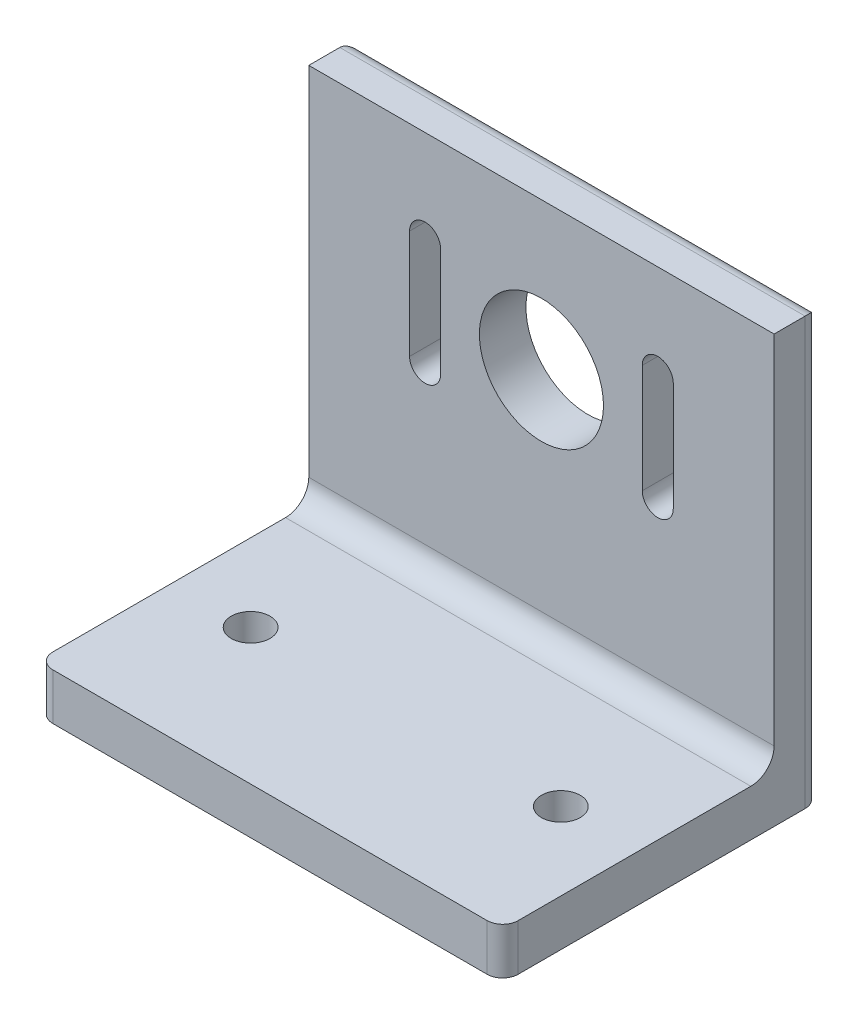
ISO-10303-21;
HEADER;
FILE_DESCRIPTION(('STEP AP214'),'2;1');
FILE_NAME('part.step','',(''),(''),'','','');
FILE_SCHEMA(('AUTOMOTIVE_DESIGN { 1 0 10303 214 1 1 1 1 }'));
ENDSEC;
DATA;
#1=APPLICATION_CONTEXT('core data for automotive mechanical design processes');
#2=APPLICATION_PROTOCOL_DEFINITION('international standard','automotive_design',2000,#1);
#3=PRODUCT_CONTEXT('',#1,'mechanical');
#4=PRODUCT('Part','Part','',(#3));
#5=PRODUCT_RELATED_PRODUCT_CATEGORY('part','',(#4));
#6=PRODUCT_DEFINITION_FORMATION('','',#4);
#7=PRODUCT_DEFINITION_CONTEXT('part definition',#1,'design');
#8=PRODUCT_DEFINITION('design','',#6,#7);
#9=PRODUCT_DEFINITION_SHAPE('','',#8);
#10=(LENGTH_UNIT() NAMED_UNIT(*) SI_UNIT(.MILLI.,.METRE.));
#11=(NAMED_UNIT(*) PLANE_ANGLE_UNIT() SI_UNIT($,.RADIAN.));
#12=(NAMED_UNIT(*) SI_UNIT($,.STERADIAN.) SOLID_ANGLE_UNIT());
#13=UNCERTAINTY_MEASURE_WITH_UNIT(LENGTH_MEASURE(1.E-05),#10,'distance_accuracy_value','');
#14=(GEOMETRIC_REPRESENTATION_CONTEXT(3) GLOBAL_UNCERTAINTY_ASSIGNED_CONTEXT((#13)) GLOBAL_UNIT_ASSIGNED_CONTEXT((#10,
#11,#12)) REPRESENTATION_CONTEXT('',''));
#15=CARTESIAN_POINT('',(0.,0.,0.));
#16=DIRECTION('',(0.,0.,1.));
#17=DIRECTION('',(1.,0.,0.));
#18=AXIS2_PLACEMENT_3D('',#15,#16,#17);
#19=CARTESIAN_POINT('',(30.,6.,-17.5));
#20=DIRECTION('',(-1.,0.,0.));
#21=DIRECTION('',(0.,0.,1.));
#22=AXIS2_PLACEMENT_3D('',#19,#20,#21);
#23=PLANE('',#22);
#24=DIRECTION('',(0.,0.,-1.));
#25=VECTOR('',#24,1.);
#26=CARTESIAN_POINT('',(30.,6.,-17.5));
#27=LINE('',#26,#25);
#28=CARTESIAN_POINT('',(30.,6.,15.5));
#29=VERTEX_POINT('',#28);
#30=CARTESIAN_POINT('',(30.,6.,-14.5));
#31=VERTEX_POINT('',#30);
#32=EDGE_CURVE('E270',#29,#31,#27,.T.);
#33=ORIENTED_EDGE('',*,*,#32,.F.);
#34=DIRECTION('',(0.,-1.,0.));
#35=VECTOR('',#34,1.);
#36=CARTESIAN_POINT('',(30.,6.,15.5));
#37=LINE('',#36,#35);
#38=CARTESIAN_POINT('',(30.,0.,15.5));
#39=VERTEX_POINT('',#38);
#40=EDGE_CURVE('E288',#29,#39,#37,.T.);
#41=ORIENTED_EDGE('',*,*,#40,.T.);
#42=DIRECTION('',(0.,0.,-1.));
#43=VECTOR('',#42,1.);
#44=CARTESIAN_POINT('',(30.,0.,-17.5));
#45=LINE('',#44,#43);
#46=CARTESIAN_POINT('',(30.,0.,-21.5));
#47=VERTEX_POINT('',#46);
#48=EDGE_CURVE('E269',#39,#47,#45,.T.);
#49=ORIENTED_EDGE('',*,*,#48,.T.);
#50=DIRECTION('',(0.,-1.,0.));
#51=VECTOR('',#50,1.);
#52=CARTESIAN_POINT('',(30.,6.,-21.5));
#53=LINE('',#52,#51);
#54=CARTESIAN_POINT('',(30.,55.,-21.5));
#55=VERTEX_POINT('',#54);
#56=EDGE_CURVE('E279',#47,#55,#53,.F.);
#57=ORIENTED_EDGE('',*,*,#56,.T.);
#58=DIRECTION('',(0.,0.,1.));
#59=VECTOR('',#58,1.);
#60=CARTESIAN_POINT('',(30.,55.,-23.5));
#61=LINE('',#60,#59);
#62=CARTESIAN_POINT('',(30.,55.,-17.5));
#63=VERTEX_POINT('',#62);
#64=EDGE_CURVE('E258',#55,#63,#61,.T.);
#65=ORIENTED_EDGE('',*,*,#64,.T.);
#66=DIRECTION('',(0.,-1.,0.));
#67=VECTOR('',#66,1.);
#68=CARTESIAN_POINT('',(30.,0.,-17.5));
#69=LINE('',#68,#67);
#70=CARTESIAN_POINT('',(30.,9.,-17.5));
#71=VERTEX_POINT('',#70);
#72=EDGE_CURVE('E252',#63,#71,#69,.T.);
#73=ORIENTED_EDGE('',*,*,#72,.T.);
#74=CARTESIAN_POINT('',(30.,9.,-14.5));
#75=DIRECTION('',(-1.,0.,0.));
#76=DIRECTION('',(0.,0.,1.));
#77=AXIS2_PLACEMENT_3D('',#74,#75,#76);
#78=CIRCLE('',#77,3.);
#79=EDGE_CURVE('E11',#71,#31,#78,.T.);
#80=ORIENTED_EDGE('',*,*,#79,.T.);
#81=EDGE_LOOP('',(#33,#41,#49,#57,#65,#73,#80));
#82=FACE_BOUND('',#81,.T.);
#83=ADVANCED_FACE('F39',(#82),#23,.F.);
#84=CARTESIAN_POINT('',(-30.,6.,-17.5));
#85=DIRECTION('',(1.,0.,0.));
#86=DIRECTION('',(0.,0.,-1.));
#87=AXIS2_PLACEMENT_3D('',#84,#85,#86);
#88=PLANE('',#87);
#89=DIRECTION('',(0.,0.,1.));
#90=VECTOR('',#89,1.);
#91=CARTESIAN_POINT('',(-30.,0.,-17.5));
#92=LINE('',#91,#90);
#93=CARTESIAN_POINT('',(-30.,0.,-21.5));
#94=VERTEX_POINT('',#93);
#95=CARTESIAN_POINT('',(-30.,0.,15.5));
#96=VERTEX_POINT('',#95);
#97=EDGE_CURVE('E282',#94,#96,#92,.T.);
#98=ORIENTED_EDGE('',*,*,#97,.T.);
#99=DIRECTION('',(0.,-1.,0.));
#100=VECTOR('',#99,1.);
#101=CARTESIAN_POINT('',(-30.,6.,15.5));
#102=LINE('',#101,#100);
#103=CARTESIAN_POINT('',(-30.,6.,15.5));
#104=VERTEX_POINT('',#103);
#105=EDGE_CURVE('E310',#96,#104,#102,.F.);
#106=ORIENTED_EDGE('',*,*,#105,.T.);
#107=DIRECTION('',(0.,0.,1.));
#108=VECTOR('',#107,1.);
#109=CARTESIAN_POINT('',(-30.,6.,-17.5));
#110=LINE('',#109,#108);
#111=CARTESIAN_POINT('',(-30.,6.,-14.5));
#112=VERTEX_POINT('',#111);
#113=EDGE_CURVE('E273',#112,#104,#110,.T.);
#114=ORIENTED_EDGE('',*,*,#113,.F.);
#115=CARTESIAN_POINT('',(-30.,9.,-14.5));
#116=DIRECTION('',(1.,0.,0.));
#117=DIRECTION('',(0.,0.,-1.));
#118=AXIS2_PLACEMENT_3D('',#115,#116,#117);
#119=CIRCLE('',#118,3.);
#120=CARTESIAN_POINT('',(-30.,9.,-17.5));
#121=VERTEX_POINT('',#120);
#122=EDGE_CURVE('E47',#112,#121,#119,.T.);
#123=ORIENTED_EDGE('',*,*,#122,.T.);
#124=DIRECTION('',(0.,1.,0.));
#125=VECTOR('',#124,1.);
#126=CARTESIAN_POINT('',(-30.,0.,-17.5));
#127=LINE('',#126,#125);
#128=CARTESIAN_POINT('',(-30.,55.,-17.5));
#129=VERTEX_POINT('',#128);
#130=EDGE_CURVE('E261',#121,#129,#127,.T.);
#131=ORIENTED_EDGE('',*,*,#130,.T.);
#132=DIRECTION('',(0.,0.,1.));
#133=VECTOR('',#132,1.);
#134=CARTESIAN_POINT('',(-30.,55.,-23.5));
#135=LINE('',#134,#133);
#136=CARTESIAN_POINT('',(-30.,55.,-21.5));
#137=VERTEX_POINT('',#136);
#138=EDGE_CURVE('E266',#137,#129,#135,.T.);
#139=ORIENTED_EDGE('',*,*,#138,.F.);
#140=DIRECTION('',(0.,1.,0.));
#141=VECTOR('',#140,1.);
#142=CARTESIAN_POINT('',(-30.,6.,-21.5));
#143=LINE('',#142,#141);
#144=EDGE_CURVE('E308',#137,#94,#143,.F.);
#145=ORIENTED_EDGE('',*,*,#144,.T.);
#146=EDGE_LOOP('',(#98,#106,#114,#123,#131,#139,#145));
#147=FACE_BOUND('',#146,.T.);
#148=ADVANCED_FACE('F336',(#147),#88,.F.);
#149=CARTESIAN_POINT('',(-30.,6.,17.5));
#150=DIRECTION('',(0.,0.,-1.));
#151=DIRECTION('',(-1.,0.,0.));
#152=AXIS2_PLACEMENT_3D('',#149,#150,#151);
#153=PLANE('',#152);
#154=DIRECTION('',(1.,0.,0.));
#155=VECTOR('',#154,1.);
#156=CARTESIAN_POINT('',(-30.,0.,17.5));
#157=LINE('',#156,#155);
#158=CARTESIAN_POINT('',(-28.,0.,17.5));
#159=VERTEX_POINT('',#158);
#160=CARTESIAN_POINT('',(28.,0.,17.5));
#161=VERTEX_POINT('',#160);
#162=EDGE_CURVE('E274',#159,#161,#157,.T.);
#163=ORIENTED_EDGE('',*,*,#162,.T.);
#164=DIRECTION('',(0.,-1.,0.));
#165=VECTOR('',#164,1.);
#166=CARTESIAN_POINT('',(28.,6.,17.5));
#167=LINE('',#166,#165);
#168=CARTESIAN_POINT('',(28.,6.,17.5));
#169=VERTEX_POINT('',#168);
#170=EDGE_CURVE('E302',#161,#169,#167,.F.);
#171=ORIENTED_EDGE('',*,*,#170,.T.);
#172=DIRECTION('',(1.,0.,0.));
#173=VECTOR('',#172,1.);
#174=CARTESIAN_POINT('',(-30.,6.,17.5));
#175=LINE('',#174,#173);
#176=CARTESIAN_POINT('',(-28.,6.,17.5));
#177=VERTEX_POINT('',#176);
#178=EDGE_CURVE('E276',#177,#169,#175,.T.);
#179=ORIENTED_EDGE('',*,*,#178,.F.);
#180=DIRECTION('',(0.,-1.,0.));
#181=VECTOR('',#180,1.);
#182=CARTESIAN_POINT('',(-28.,6.,17.5));
#183=LINE('',#182,#181);
#184=EDGE_CURVE('E299',#177,#159,#183,.T.);
#185=ORIENTED_EDGE('',*,*,#184,.T.);
#186=EDGE_LOOP('',(#163,#171,#179,#185));
#187=FACE_BOUND('',#186,.T.);
#188=ADVANCED_FACE('F346',(#187),#153,.F.);
#189=CARTESIAN_POINT('',(0.,6.,0.));
#190=DIRECTION('',(0.,1.,0.));
#191=DIRECTION('',(0.,0.,1.));
#192=AXIS2_PLACEMENT_3D('',#189,#190,#191);
#193=PLANE('',#192);
#194=CARTESIAN_POINT('',(-20.,6.,0.));
#195=DIRECTION('',(0.,1.,0.));
#196=DIRECTION('',(0.,0.,1.));
#197=AXIS2_PLACEMENT_3D('',#194,#195,#196);
#198=CIRCLE('',#197,2.5);
#199=CARTESIAN_POINT('',(-20.,6.,2.5));
#200=VERTEX_POINT('',#199);
#201=EDGE_CURVE('E631',#200,#200,#198,.T.);
#202=ORIENTED_EDGE('',*,*,#201,.F.);
#203=EDGE_LOOP('',(#202));
#204=FACE_BOUND('',#203,.T.);
#205=CARTESIAN_POINT('',(20.,6.,0.));
#206=DIRECTION('',(0.,1.,0.));
#207=DIRECTION('',(0.,0.,1.));
#208=AXIS2_PLACEMENT_3D('',#205,#206,#207);
#209=CIRCLE('',#208,2.5);
#210=CARTESIAN_POINT('',(20.,6.,2.5));
#211=VERTEX_POINT('',#210);
#212=EDGE_CURVE('E629',#211,#211,#209,.T.);
#213=ORIENTED_EDGE('',*,*,#212,.F.);
#214=EDGE_LOOP('',(#213));
#215=FACE_BOUND('',#214,.T.);
#216=ORIENTED_EDGE('',*,*,#32,.T.);
#217=DIRECTION('',(-1.,0.,0.));
#218=VECTOR('',#217,1.);
#219=CARTESIAN_POINT('',(-30.,6.,-14.5));
#220=LINE('',#219,#218);
#221=EDGE_CURVE('E322',#31,#112,#220,.T.);
#222=ORIENTED_EDGE('',*,*,#221,.T.);
#223=ORIENTED_EDGE('',*,*,#113,.T.);
#224=CARTESIAN_POINT('',(-28.,6.,15.5));
#225=DIRECTION('',(0.,1.,0.));
#226=DIRECTION('',(0.,0.,1.));
#227=AXIS2_PLACEMENT_3D('',#224,#225,#226);
#228=CIRCLE('',#227,2.);
#229=EDGE_CURVE('E304',#104,#177,#228,.T.);
#230=ORIENTED_EDGE('',*,*,#229,.T.);
#231=ORIENTED_EDGE('',*,*,#178,.T.);
#232=CARTESIAN_POINT('',(28.,6.,15.5));
#233=DIRECTION('',(0.,1.,0.));
#234=DIRECTION('',(0.,0.,1.));
#235=AXIS2_PLACEMENT_3D('',#232,#233,#234);
#236=CIRCLE('',#235,2.);
#237=EDGE_CURVE('E306',#169,#29,#236,.T.);
#238=ORIENTED_EDGE('',*,*,#237,.T.);
#239=EDGE_LOOP('',(#216,#222,#223,#230,#231,#238));
#240=FACE_BOUND('',#239,.T.);
#241=ADVANCED_FACE('F332',(#204,#215,#240),#193,.T.);
#242=CARTESIAN_POINT('',(0.,0.,0.));
#243=DIRECTION('',(0.,1.,0.));
#244=DIRECTION('',(0.,0.,1.));
#245=AXIS2_PLACEMENT_3D('',#242,#243,#244);
#246=PLANE('',#245);
#247=CARTESIAN_POINT('',(-20.,0.,0.));
#248=DIRECTION('',(0.,1.,0.));
#249=DIRECTION('',(0.,0.,1.));
#250=AXIS2_PLACEMENT_3D('',#247,#248,#249);
#251=CIRCLE('',#250,2.5);
#252=CARTESIAN_POINT('',(-20.,0.,2.5));
#253=VERTEX_POINT('',#252);
#254=EDGE_CURVE('E227',#253,#253,#251,.T.);
#255=ORIENTED_EDGE('',*,*,#254,.T.);
#256=EDGE_LOOP('',(#255));
#257=FACE_BOUND('',#256,.T.);
#258=CARTESIAN_POINT('',(20.,0.,0.));
#259=DIRECTION('',(0.,1.,0.));
#260=DIRECTION('',(0.,0.,1.));
#261=AXIS2_PLACEMENT_3D('',#258,#259,#260);
#262=CIRCLE('',#261,2.5);
#263=CARTESIAN_POINT('',(20.,0.,2.5));
#264=VERTEX_POINT('',#263);
#265=EDGE_CURVE('E200',#264,#264,#262,.T.);
#266=ORIENTED_EDGE('',*,*,#265,.T.);
#267=EDGE_LOOP('',(#266));
#268=FACE_BOUND('',#267,.T.);
#269=ORIENTED_EDGE('',*,*,#48,.F.);
#270=CARTESIAN_POINT('',(28.,0.,15.5));
#271=DIRECTION('',(0.,1.,0.));
#272=DIRECTION('',(0.,0.,1.));
#273=AXIS2_PLACEMENT_3D('',#270,#271,#272);
#274=CIRCLE('',#273,2.);
#275=EDGE_CURVE('E297',#39,#161,#274,.F.);
#276=ORIENTED_EDGE('',*,*,#275,.T.);
#277=ORIENTED_EDGE('',*,*,#162,.F.);
#278=CARTESIAN_POINT('',(-28.,0.,15.5));
#279=DIRECTION('',(0.,1.,0.));
#280=DIRECTION('',(0.,0.,1.));
#281=AXIS2_PLACEMENT_3D('',#278,#279,#280);
#282=CIRCLE('',#281,2.);
#283=EDGE_CURVE('E295',#159,#96,#282,.F.);
#284=ORIENTED_EDGE('',*,*,#283,.T.);
#285=ORIENTED_EDGE('',*,*,#97,.F.);
#286=CARTESIAN_POINT('',(-28.,0.,-21.5));
#287=DIRECTION('',(0.,1.,0.));
#288=DIRECTION('',(0.,0.,1.));
#289=AXIS2_PLACEMENT_3D('',#286,#287,#288);
#290=CIRCLE('',#289,2.);
#291=CARTESIAN_POINT('',(-28.,0.,-23.5));
#292=VERTEX_POINT('',#291);
#293=EDGE_CURVE('E291',#94,#292,#290,.F.);
#294=ORIENTED_EDGE('',*,*,#293,.T.);
#295=DIRECTION('',(-1.,0.,0.));
#296=VECTOR('',#295,1.);
#297=CARTESIAN_POINT('',(30.,0.,-23.5));
#298=LINE('',#297,#296);
#299=CARTESIAN_POINT('',(28.,0.,-23.5));
#300=VERTEX_POINT('',#299);
#301=EDGE_CURVE('E255',#300,#292,#298,.T.);
#302=ORIENTED_EDGE('',*,*,#301,.F.);
#303=CARTESIAN_POINT('',(28.,0.,-21.5));
#304=DIRECTION('',(0.,1.,0.));
#305=DIRECTION('',(0.,0.,1.));
#306=AXIS2_PLACEMENT_3D('',#303,#304,#305);
#307=CIRCLE('',#306,2.);
#308=EDGE_CURVE('E293',#300,#47,#307,.F.);
#309=ORIENTED_EDGE('',*,*,#308,.T.);
#310=EDGE_LOOP('',(#269,#276,#277,#284,#285,#294,#302,#309));
#311=FACE_BOUND('',#310,.T.);
#312=ADVANCED_FACE('F389',(#257,#268,#311),#246,.F.);
#313=CARTESIAN_POINT('',(0.,0.,-17.5));
#314=DIRECTION('',(0.,0.,1.));
#315=DIRECTION('',(1.,0.,0.));
#316=AXIS2_PLACEMENT_3D('',#313,#314,#315);
#317=PLANE('',#316);
#318=CARTESIAN_POINT('',(-15.,43.,-17.5));
#319=DIRECTION('',(0.,0.,1.));
#320=DIRECTION('',(1.,0.,0.));
#321=AXIS2_PLACEMENT_3D('',#318,#319,#320);
#322=CIRCLE('',#321,2.);
#323=CARTESIAN_POINT('',(-13.,43.,-17.5));
#324=VERTEX_POINT('',#323);
#325=CARTESIAN_POINT('',(-17.,43.,-17.5));
#326=VERTEX_POINT('',#325);
#327=EDGE_CURVE('E176',#324,#326,#322,.T.);
#328=ORIENTED_EDGE('',*,*,#327,.F.);
#329=DIRECTION('',(0.,1.,0.));
#330=VECTOR('',#329,1.);
#331=CARTESIAN_POINT('',(-13.,43.,-17.5));
#332=LINE('',#331,#330);
#333=CARTESIAN_POINT('',(-13.,29.,-17.5));
#334=VERTEX_POINT('',#333);
#335=EDGE_CURVE('E194',#334,#324,#332,.T.);
#336=ORIENTED_EDGE('',*,*,#335,.F.);
#337=CARTESIAN_POINT('',(-15.,29.,-17.5));
#338=DIRECTION('',(0.,0.,1.));
#339=DIRECTION('',(1.,0.,0.));
#340=AXIS2_PLACEMENT_3D('',#337,#338,#339);
#341=CIRCLE('',#340,2.);
#342=CARTESIAN_POINT('',(-17.,29.,-17.5));
#343=VERTEX_POINT('',#342);
#344=EDGE_CURVE('E197',#343,#334,#341,.T.);
#345=ORIENTED_EDGE('',*,*,#344,.F.);
#346=DIRECTION('',(0.,-1.,0.));
#347=VECTOR('',#346,1.);
#348=CARTESIAN_POINT('',(-17.,43.,-17.5));
#349=LINE('',#348,#347);
#350=EDGE_CURVE('E206',#326,#343,#349,.T.);
#351=ORIENTED_EDGE('',*,*,#350,.F.);
#352=EDGE_LOOP('',(#328,#336,#345,#351));
#353=FACE_BOUND('',#352,.T.);
#354=CARTESIAN_POINT('',(15.,43.,-17.5));
#355=DIRECTION('',(0.,0.,1.));
#356=DIRECTION('',(1.,0.,0.));
#357=AXIS2_PLACEMENT_3D('',#354,#355,#356);
#358=CIRCLE('',#357,2.00000000000001);
#359=CARTESIAN_POINT('',(17.,43.,-17.5));
#360=VERTEX_POINT('',#359);
#361=CARTESIAN_POINT('',(13.,43.,-17.5));
#362=VERTEX_POINT('',#361);
#363=EDGE_CURVE('E207',#360,#362,#358,.T.);
#364=ORIENTED_EDGE('',*,*,#363,.F.);
#365=DIRECTION('',(0.,1.,0.));
#366=VECTOR('',#365,1.);
#367=CARTESIAN_POINT('',(17.,43.,-17.5));
#368=LINE('',#367,#366);
#369=CARTESIAN_POINT('',(17.,29.,-17.5));
#370=VERTEX_POINT('',#369);
#371=EDGE_CURVE('E228',#370,#360,#368,.T.);
#372=ORIENTED_EDGE('',*,*,#371,.F.);
#373=CARTESIAN_POINT('',(15.,29.,-17.5));
#374=DIRECTION('',(0.,0.,1.));
#375=DIRECTION('',(1.,0.,0.));
#376=AXIS2_PLACEMENT_3D('',#373,#374,#375);
#377=CIRCLE('',#376,2.00000000000001);
#378=CARTESIAN_POINT('',(13.,29.,-17.5));
#379=VERTEX_POINT('',#378);
#380=EDGE_CURVE('E231',#379,#370,#377,.T.);
#381=ORIENTED_EDGE('',*,*,#380,.F.);
#382=DIRECTION('',(0.,-1.,0.));
#383=VECTOR('',#382,1.);
#384=CARTESIAN_POINT('',(13.,43.,-17.5));
#385=LINE('',#384,#383);
#386=EDGE_CURVE('E235',#362,#379,#385,.T.);
#387=ORIENTED_EDGE('',*,*,#386,.F.);
#388=EDGE_LOOP('',(#364,#372,#381,#387));
#389=FACE_BOUND('',#388,.T.);
#390=CARTESIAN_POINT('',(0.,36.,-17.5));
#391=DIRECTION('',(0.,0.,1.));
#392=DIRECTION('',(1.,0.,0.));
#393=AXIS2_PLACEMENT_3D('',#390,#391,#392);
#394=CIRCLE('',#393,8.);
#395=CARTESIAN_POINT('',(8.,36.,-17.5));
#396=VERTEX_POINT('',#395);
#397=EDGE_CURVE('E213',#396,#396,#394,.T.);
#398=ORIENTED_EDGE('',*,*,#397,.F.);
#399=EDGE_LOOP('',(#398));
#400=FACE_BOUND('',#399,.T.);
#401=ORIENTED_EDGE('',*,*,#130,.F.);
#402=DIRECTION('',(-1.,0.,0.));
#403=VECTOR('',#402,1.);
#404=CARTESIAN_POINT('',(30.,9.,-17.5));
#405=LINE('',#404,#403);
#406=EDGE_CURVE('E60',#121,#71,#405,.F.);
#407=ORIENTED_EDGE('',*,*,#406,.T.);
#408=ORIENTED_EDGE('',*,*,#72,.F.);
#409=DIRECTION('',(1.,0.,0.));
#410=VECTOR('',#409,1.);
#411=CARTESIAN_POINT('',(30.,55.,-17.5));
#412=LINE('',#411,#410);
#413=EDGE_CURVE('E259',#129,#63,#412,.T.);
#414=ORIENTED_EDGE('',*,*,#413,.F.);
#415=EDGE_LOOP('',(#401,#407,#408,#414));
#416=FACE_BOUND('',#415,.T.);
#417=ADVANCED_FACE('F402',(#353,#389,#400,#416),#317,.T.);
#418=CARTESIAN_POINT('',(30.,55.,-23.5));
#419=DIRECTION('',(0.,-1.,0.));
#420=DIRECTION('',(0.,0.,-1.));
#421=AXIS2_PLACEMENT_3D('',#418,#419,#420);
#422=PLANE('',#421);
#423=ORIENTED_EDGE('',*,*,#64,.F.);
#424=DIRECTION('',(1.,0.,0.));
#425=VECTOR('',#424,1.);
#426=CARTESIAN_POINT('',(30.,55.,-21.5));
#427=LINE('',#426,#425);
#428=EDGE_CURVE('E320',#55,#137,#427,.F.);
#429=ORIENTED_EDGE('',*,*,#428,.T.);
#430=ORIENTED_EDGE('',*,*,#138,.T.);
#431=ORIENTED_EDGE('',*,*,#413,.T.);
#432=EDGE_LOOP('',(#423,#429,#430,#431));
#433=FACE_BOUND('',#432,.T.);
#434=ADVANCED_FACE('F399',(#433),#422,.F.);
#435=CARTESIAN_POINT('',(0.,0.,-23.5));
#436=DIRECTION('',(0.,0.,1.));
#437=DIRECTION('',(1.,0.,0.));
#438=AXIS2_PLACEMENT_3D('',#435,#436,#437);
#439=PLANE('',#438);
#440=DIRECTION('',(0.,1.,0.));
#441=VECTOR('',#440,1.);
#442=CARTESIAN_POINT('',(-13.,43.,-23.5));
#443=LINE('',#442,#441);
#444=CARTESIAN_POINT('',(-13.,29.,-23.5));
#445=VERTEX_POINT('',#444);
#446=CARTESIAN_POINT('',(-13.,43.,-23.5));
#447=VERTEX_POINT('',#446);
#448=EDGE_CURVE('E181',#445,#447,#443,.T.);
#449=ORIENTED_EDGE('',*,*,#448,.T.);
#450=CARTESIAN_POINT('',(-15.,43.,-23.5));
#451=DIRECTION('',(0.,0.,1.));
#452=DIRECTION('',(1.,0.,0.));
#453=AXIS2_PLACEMENT_3D('',#450,#451,#452);
#454=CIRCLE('',#453,2.);
#455=CARTESIAN_POINT('',(-17.,43.,-23.5));
#456=VERTEX_POINT('',#455);
#457=EDGE_CURVE('E173',#447,#456,#454,.T.);
#458=ORIENTED_EDGE('',*,*,#457,.T.);
#459=DIRECTION('',(0.,-1.,0.));
#460=VECTOR('',#459,1.);
#461=CARTESIAN_POINT('',(-17.,43.,-23.5));
#462=LINE('',#461,#460);
#463=CARTESIAN_POINT('',(-17.,29.,-23.5));
#464=VERTEX_POINT('',#463);
#465=EDGE_CURVE('E185',#456,#464,#462,.T.);
#466=ORIENTED_EDGE('',*,*,#465,.T.);
#467=CARTESIAN_POINT('',(-15.,29.,-23.5));
#468=DIRECTION('',(0.,0.,1.));
#469=DIRECTION('',(1.,0.,0.));
#470=AXIS2_PLACEMENT_3D('',#467,#468,#469);
#471=CIRCLE('',#470,2.);
#472=EDGE_CURVE('E189',#464,#445,#471,.T.);
#473=ORIENTED_EDGE('',*,*,#472,.T.);
#474=EDGE_LOOP('',(#449,#458,#466,#473));
#475=FACE_BOUND('',#474,.T.);
#476=DIRECTION('',(0.,1.,0.));
#477=VECTOR('',#476,1.);
#478=CARTESIAN_POINT('',(17.,43.,-23.5));
#479=LINE('',#478,#477);
#480=CARTESIAN_POINT('',(17.,29.,-23.5));
#481=VERTEX_POINT('',#480);
#482=CARTESIAN_POINT('',(17.,43.,-23.5));
#483=VERTEX_POINT('',#482);
#484=EDGE_CURVE('E220',#481,#483,#479,.T.);
#485=ORIENTED_EDGE('',*,*,#484,.T.);
#486=CARTESIAN_POINT('',(15.,43.,-23.5));
#487=DIRECTION('',(0.,0.,1.));
#488=DIRECTION('',(1.,0.,0.));
#489=AXIS2_PLACEMENT_3D('',#486,#487,#488);
#490=CIRCLE('',#489,2.00000000000001);
#491=CARTESIAN_POINT('',(13.,43.,-23.5));
#492=VERTEX_POINT('',#491);
#493=EDGE_CURVE('E232',#483,#492,#490,.T.);
#494=ORIENTED_EDGE('',*,*,#493,.T.);
#495=DIRECTION('',(0.,-1.,0.));
#496=VECTOR('',#495,1.);
#497=CARTESIAN_POINT('',(13.,43.,-23.5));
#498=LINE('',#497,#496);
#499=CARTESIAN_POINT('',(13.,29.,-23.5));
#500=VERTEX_POINT('',#499);
#501=EDGE_CURVE('E244',#492,#500,#498,.T.);
#502=ORIENTED_EDGE('',*,*,#501,.T.);
#503=CARTESIAN_POINT('',(15.,29.,-23.5));
#504=DIRECTION('',(0.,0.,1.));
#505=DIRECTION('',(1.,0.,0.));
#506=AXIS2_PLACEMENT_3D('',#503,#504,#505);
#507=CIRCLE('',#506,2.00000000000001);
#508=EDGE_CURVE('E241',#500,#481,#507,.T.);
#509=ORIENTED_EDGE('',*,*,#508,.T.);
#510=EDGE_LOOP('',(#485,#494,#502,#509));
#511=FACE_BOUND('',#510,.T.);
#512=CARTESIAN_POINT('',(0.,36.,-23.5));
#513=DIRECTION('',(0.,0.,1.));
#514=DIRECTION('',(1.,0.,0.));
#515=AXIS2_PLACEMENT_3D('',#512,#513,#514);
#516=CIRCLE('',#515,8.);
#517=CARTESIAN_POINT('',(8.,36.,-23.5));
#518=VERTEX_POINT('',#517);
#519=EDGE_CURVE('E249',#518,#518,#516,.T.);
#520=ORIENTED_EDGE('',*,*,#519,.T.);
#521=EDGE_LOOP('',(#520));
#522=FACE_BOUND('',#521,.T.);
#523=DIRECTION('',(1.,0.,0.));
#524=VECTOR('',#523,1.);
#525=CARTESIAN_POINT('',(0.,53.,-23.5));
#526=LINE('',#525,#524);
#527=CARTESIAN_POINT('',(-28.,53.,-23.5));
#528=VERTEX_POINT('',#527);
#529=CARTESIAN_POINT('',(28.,53.,-23.5));
#530=VERTEX_POINT('',#529);
#531=EDGE_CURVE('E315',#528,#530,#526,.T.);
#532=ORIENTED_EDGE('',*,*,#531,.T.);
#533=DIRECTION('',(0.,-1.,0.));
#534=VECTOR('',#533,1.);
#535=CARTESIAN_POINT('',(28.,0.,-23.5));
#536=LINE('',#535,#534);
#537=EDGE_CURVE('E318',#530,#300,#536,.T.);
#538=ORIENTED_EDGE('',*,*,#537,.T.);
#539=ORIENTED_EDGE('',*,*,#301,.T.);
#540=DIRECTION('',(0.,1.,0.));
#541=VECTOR('',#540,1.);
#542=CARTESIAN_POINT('',(-28.,0.,-23.5));
#543=LINE('',#542,#541);
#544=EDGE_CURVE('E313',#292,#528,#543,.T.);
#545=ORIENTED_EDGE('',*,*,#544,.T.);
#546=EDGE_LOOP('',(#532,#538,#539,#545));
#547=FACE_BOUND('',#546,.T.);
#548=ADVANCED_FACE('F191',(#475,#511,#522,#547),#439,.F.);
#549=CARTESIAN_POINT('',(0.,36.,-23.5));
#550=DIRECTION('',(0.,0.,1.));
#551=DIRECTION('',(1.,0.,0.));
#552=AXIS2_PLACEMENT_3D('',#549,#550,#551);
#553=CYLINDRICAL_SURFACE('',#552,8.);
#554=ORIENTED_EDGE('',*,*,#519,.F.);
#555=EDGE_LOOP('',(#554));
#556=FACE_BOUND('',#555,.T.);
#557=ORIENTED_EDGE('',*,*,#397,.T.);
#558=EDGE_LOOP('',(#557));
#559=FACE_BOUND('',#558,.T.);
#560=ADVANCED_FACE('F444',(#556,#559),#553,.F.);
#561=CARTESIAN_POINT('',(15.,43.,-23.5));
#562=DIRECTION('',(0.,0.,1.));
#563=DIRECTION('',(1.,0.,0.));
#564=AXIS2_PLACEMENT_3D('',#561,#562,#563);
#565=CYLINDRICAL_SURFACE('',#564,2.00000000000001);
#566=ORIENTED_EDGE('',*,*,#363,.T.);
#567=DIRECTION('',(0.,0.,1.));
#568=VECTOR('',#567,1.);
#569=CARTESIAN_POINT('',(13.,43.,-23.5));
#570=LINE('',#569,#568);
#571=EDGE_CURVE('E217',#492,#362,#570,.T.);
#572=ORIENTED_EDGE('',*,*,#571,.F.);
#573=ORIENTED_EDGE('',*,*,#493,.F.);
#574=DIRECTION('',(0.,0.,1.));
#575=VECTOR('',#574,1.);
#576=CARTESIAN_POINT('',(17.,43.,-23.5));
#577=LINE('',#576,#575);
#578=EDGE_CURVE('E225',#483,#360,#577,.T.);
#579=ORIENTED_EDGE('',*,*,#578,.T.);
#580=EDGE_LOOP('',(#566,#572,#573,#579));
#581=FACE_BOUND('',#580,.T.);
#582=ADVANCED_FACE('F551',(#581),#565,.F.);
#583=CARTESIAN_POINT('',(17.,43.,-23.5));
#584=DIRECTION('',(1.,0.,0.));
#585=DIRECTION('',(0.,0.,-1.));
#586=AXIS2_PLACEMENT_3D('',#583,#584,#585);
#587=PLANE('',#586);
#588=ORIENTED_EDGE('',*,*,#371,.T.);
#589=ORIENTED_EDGE('',*,*,#578,.F.);
#590=ORIENTED_EDGE('',*,*,#484,.F.);
#591=DIRECTION('',(0.,0.,1.));
#592=VECTOR('',#591,1.);
#593=CARTESIAN_POINT('',(17.,29.,-23.5));
#594=LINE('',#593,#592);
#595=EDGE_CURVE('E223',#481,#370,#594,.T.);
#596=ORIENTED_EDGE('',*,*,#595,.T.);
#597=EDGE_LOOP('',(#588,#589,#590,#596));
#598=FACE_BOUND('',#597,.T.);
#599=ADVANCED_FACE('F542',(#598),#587,.F.);
#600=CARTESIAN_POINT('',(15.,29.,-23.5));
#601=DIRECTION('',(0.,0.,1.));
#602=DIRECTION('',(1.,0.,0.));
#603=AXIS2_PLACEMENT_3D('',#600,#601,#602);
#604=CYLINDRICAL_SURFACE('',#603,2.00000000000001);
#605=ORIENTED_EDGE('',*,*,#380,.T.);
#606=ORIENTED_EDGE('',*,*,#595,.F.);
#607=ORIENTED_EDGE('',*,*,#508,.F.);
#608=DIRECTION('',(0.,0.,1.));
#609=VECTOR('',#608,1.);
#610=CARTESIAN_POINT('',(13.,29.,-23.5));
#611=LINE('',#610,#609);
#612=EDGE_CURVE('E221',#500,#379,#611,.T.);
#613=ORIENTED_EDGE('',*,*,#612,.T.);
#614=EDGE_LOOP('',(#605,#606,#607,#613));
#615=FACE_BOUND('',#614,.T.);
#616=ADVANCED_FACE('F533',(#615),#604,.F.);
#617=CARTESIAN_POINT('',(13.,43.,-23.5));
#618=DIRECTION('',(-1.,0.,0.));
#619=DIRECTION('',(0.,0.,1.));
#620=AXIS2_PLACEMENT_3D('',#617,#618,#619);
#621=PLANE('',#620);
#622=ORIENTED_EDGE('',*,*,#386,.T.);
#623=ORIENTED_EDGE('',*,*,#612,.F.);
#624=ORIENTED_EDGE('',*,*,#501,.F.);
#625=ORIENTED_EDGE('',*,*,#571,.T.);
#626=EDGE_LOOP('',(#622,#623,#624,#625));
#627=FACE_BOUND('',#626,.T.);
#628=ADVANCED_FACE('F525',(#627),#621,.F.);
#629=CARTESIAN_POINT('',(-15.,43.,-23.5));
#630=DIRECTION('',(0.,0.,1.));
#631=DIRECTION('',(1.,0.,0.));
#632=AXIS2_PLACEMENT_3D('',#629,#630,#631);
#633=CYLINDRICAL_SURFACE('',#632,2.);
#634=ORIENTED_EDGE('',*,*,#327,.T.);
#635=DIRECTION('',(0.,0.,1.));
#636=VECTOR('',#635,1.);
#637=CARTESIAN_POINT('',(-17.,43.,-23.5));
#638=LINE('',#637,#636);
#639=EDGE_CURVE('E169',#456,#326,#638,.T.);
#640=ORIENTED_EDGE('',*,*,#639,.F.);
#641=ORIENTED_EDGE('',*,*,#457,.F.);
#642=DIRECTION('',(0.,0.,1.));
#643=VECTOR('',#642,1.);
#644=CARTESIAN_POINT('',(-13.,43.,-23.5));
#645=LINE('',#644,#643);
#646=EDGE_CURVE('E211',#447,#324,#645,.T.);
#647=ORIENTED_EDGE('',*,*,#646,.T.);
#648=EDGE_LOOP('',(#634,#640,#641,#647));
#649=FACE_BOUND('',#648,.T.);
#650=ADVANCED_FACE('F171',(#649),#633,.F.);
#651=CARTESIAN_POINT('',(-13.,43.,-23.5));
#652=DIRECTION('',(1.,0.,0.));
#653=DIRECTION('',(0.,0.,-1.));
#654=AXIS2_PLACEMENT_3D('',#651,#652,#653);
#655=PLANE('',#654);
#656=ORIENTED_EDGE('',*,*,#335,.T.);
#657=ORIENTED_EDGE('',*,*,#646,.F.);
#658=ORIENTED_EDGE('',*,*,#448,.F.);
#659=DIRECTION('',(0.,0.,1.));
#660=VECTOR('',#659,1.);
#661=CARTESIAN_POINT('',(-13.,29.,-23.5));
#662=LINE('',#661,#660);
#663=EDGE_CURVE('E214',#445,#334,#662,.T.);
#664=ORIENTED_EDGE('',*,*,#663,.T.);
#665=EDGE_LOOP('',(#656,#657,#658,#664));
#666=FACE_BOUND('',#665,.T.);
#667=ADVANCED_FACE('F508',(#666),#655,.F.);
#668=CARTESIAN_POINT('',(-15.,29.,-23.5));
#669=DIRECTION('',(0.,0.,1.));
#670=DIRECTION('',(1.,0.,0.));
#671=AXIS2_PLACEMENT_3D('',#668,#669,#670);
#672=CYLINDRICAL_SURFACE('',#671,2.);
#673=ORIENTED_EDGE('',*,*,#344,.T.);
#674=ORIENTED_EDGE('',*,*,#663,.F.);
#675=ORIENTED_EDGE('',*,*,#472,.F.);
#676=DIRECTION('',(0.,0.,1.));
#677=VECTOR('',#676,1.);
#678=CARTESIAN_POINT('',(-17.,29.,-23.5));
#679=LINE('',#678,#677);
#680=EDGE_CURVE('E180',#464,#343,#679,.T.);
#681=ORIENTED_EDGE('',*,*,#680,.T.);
#682=EDGE_LOOP('',(#673,#674,#675,#681));
#683=FACE_BOUND('',#682,.T.);
#684=ADVANCED_FACE('F500',(#683),#672,.F.);
#685=CARTESIAN_POINT('',(-17.,43.,-23.5));
#686=DIRECTION('',(-1.,0.,0.));
#687=DIRECTION('',(0.,0.,1.));
#688=AXIS2_PLACEMENT_3D('',#685,#686,#687);
#689=PLANE('',#688);
#690=ORIENTED_EDGE('',*,*,#350,.T.);
#691=ORIENTED_EDGE('',*,*,#680,.F.);
#692=ORIENTED_EDGE('',*,*,#465,.F.);
#693=ORIENTED_EDGE('',*,*,#639,.T.);
#694=EDGE_LOOP('',(#690,#691,#692,#693));
#695=FACE_BOUND('',#694,.T.);
#696=ADVANCED_FACE('F186',(#695),#689,.F.);
#697=CARTESIAN_POINT('',(20.,0.,0.));
#698=DIRECTION('',(0.,1.,0.));
#699=DIRECTION('',(0.,0.,1.));
#700=AXIS2_PLACEMENT_3D('',#697,#698,#699);
#701=CYLINDRICAL_SURFACE('',#700,2.5);
#702=ORIENTED_EDGE('',*,*,#265,.F.);
#703=EDGE_LOOP('',(#702));
#704=FACE_BOUND('',#703,.T.);
#705=ORIENTED_EDGE('',*,*,#212,.T.);
#706=EDGE_LOOP('',(#705));
#707=FACE_BOUND('',#706,.T.);
#708=ADVANCED_FACE('F484',(#704,#707),#701,.F.);
#709=CARTESIAN_POINT('',(-20.,0.,0.));
#710=DIRECTION('',(0.,1.,0.));
#711=DIRECTION('',(0.,0.,1.));
#712=AXIS2_PLACEMENT_3D('',#709,#710,#711);
#713=CYLINDRICAL_SURFACE('',#712,2.5);
#714=ORIENTED_EDGE('',*,*,#254,.F.);
#715=EDGE_LOOP('',(#714));
#716=FACE_BOUND('',#715,.T.);
#717=ORIENTED_EDGE('',*,*,#201,.T.);
#718=EDGE_LOOP('',(#717));
#719=FACE_BOUND('',#718,.T.);
#720=ADVANCED_FACE('F373',(#716,#719),#713,.F.);
#721=CARTESIAN_POINT('',(28.,6.,15.5));
#722=DIRECTION('',(0.,-1.,0.));
#723=DIRECTION('',(0.,0.,-1.));
#724=AXIS2_PLACEMENT_3D('',#721,#722,#723);
#725=CYLINDRICAL_SURFACE('',#724,2.);
#726=ORIENTED_EDGE('',*,*,#237,.F.);
#727=ORIENTED_EDGE('',*,*,#170,.F.);
#728=ORIENTED_EDGE('',*,*,#275,.F.);
#729=ORIENTED_EDGE('',*,*,#40,.F.);
#730=EDGE_LOOP('',(#726,#727,#728,#729));
#731=FACE_BOUND('',#730,.T.);
#732=ADVANCED_FACE('F350',(#731),#725,.T.);
#733=CARTESIAN_POINT('',(-28.,6.,15.5));
#734=DIRECTION('',(0.,-1.,0.));
#735=DIRECTION('',(0.,0.,-1.));
#736=AXIS2_PLACEMENT_3D('',#733,#734,#735);
#737=CYLINDRICAL_SURFACE('',#736,2.);
#738=ORIENTED_EDGE('',*,*,#229,.F.);
#739=ORIENTED_EDGE('',*,*,#105,.F.);
#740=ORIENTED_EDGE('',*,*,#283,.F.);
#741=ORIENTED_EDGE('',*,*,#184,.F.);
#742=EDGE_LOOP('',(#738,#739,#740,#741));
#743=FACE_BOUND('',#742,.T.);
#744=ADVANCED_FACE('F342',(#743),#737,.T.);
#745=CARTESIAN_POINT('',(-28.,0.,-21.5));
#746=DIRECTION('',(0.,1.,0.));
#747=DIRECTION('',(0.,0.,1.));
#748=AXIS2_PLACEMENT_3D('',#745,#746,#747);
#749=CYLINDRICAL_SURFACE('',#748,2.);
#750=ORIENTED_EDGE('',*,*,#293,.F.);
#751=ORIENTED_EDGE('',*,*,#144,.F.);
#752=CARTESIAN_POINT('',(-28.,53.,-21.5));
#753=DIRECTION('',(0.707106781186547,0.707106781186547,0.));
#754=DIRECTION('',(-0.707106781186547,0.707106781186547,0.));
#755=AXIS2_PLACEMENT_3D('',#752,#753,#754);
#756=ELLIPSE('',#755,2.82842712474619,2.);
#757=EDGE_CURVE('E325',#528,#137,#756,.T.);
#758=ORIENTED_EDGE('',*,*,#757,.F.);
#759=ORIENTED_EDGE('',*,*,#544,.F.);
#760=EDGE_LOOP('',(#750,#751,#758,#759));
#761=FACE_BOUND('',#760,.T.);
#762=ADVANCED_FACE('F375',(#761),#749,.T.);
#763=CARTESIAN_POINT('',(28.,0.,-21.5));
#764=DIRECTION('',(0.,-1.,0.));
#765=DIRECTION('',(0.,0.,-1.));
#766=AXIS2_PLACEMENT_3D('',#763,#764,#765);
#767=CYLINDRICAL_SURFACE('',#766,2.);
#768=ORIENTED_EDGE('',*,*,#308,.F.);
#769=ORIENTED_EDGE('',*,*,#537,.F.);
#770=CARTESIAN_POINT('',(28.,53.,-21.5));
#771=DIRECTION('',(0.707106781186547,-0.707106781186547,0.));
#772=DIRECTION('',(-0.707106781186547,-0.707106781186547,0.));
#773=AXIS2_PLACEMENT_3D('',#770,#771,#772);
#774=ELLIPSE('',#773,2.82842712474619,2.);
#775=EDGE_CURVE('E323',#55,#530,#774,.F.);
#776=ORIENTED_EDGE('',*,*,#775,.F.);
#777=ORIENTED_EDGE('',*,*,#56,.F.);
#778=EDGE_LOOP('',(#768,#769,#776,#777));
#779=FACE_BOUND('',#778,.T.);
#780=ADVANCED_FACE('F360',(#779),#767,.T.);
#781=CARTESIAN_POINT('',(0.,53.,-21.5));
#782=DIRECTION('',(1.,0.,0.));
#783=DIRECTION('',(0.,0.,-1.));
#784=AXIS2_PLACEMENT_3D('',#781,#782,#783);
#785=CYLINDRICAL_SURFACE('',#784,2.);
#786=ORIENTED_EDGE('',*,*,#757,.T.);
#787=ORIENTED_EDGE('',*,*,#428,.F.);
#788=ORIENTED_EDGE('',*,*,#775,.T.);
#789=ORIENTED_EDGE('',*,*,#531,.F.);
#790=EDGE_LOOP('',(#786,#787,#788,#789));
#791=FACE_BOUND('',#790,.T.);
#792=ADVANCED_FACE('F355',(#791),#785,.T.);
#793=CARTESIAN_POINT('',(0.,9.,-14.5));
#794=DIRECTION('',(1.,0.,0.));
#795=DIRECTION('',(0.,0.,-1.));
#796=AXIS2_PLACEMENT_3D('',#793,#794,#795);
#797=CYLINDRICAL_SURFACE('',#796,3.);
#798=ORIENTED_EDGE('',*,*,#79,.F.);
#799=ORIENTED_EDGE('',*,*,#406,.F.);
#800=ORIENTED_EDGE('',*,*,#122,.F.);
#801=ORIENTED_EDGE('',*,*,#221,.F.);
#802=EDGE_LOOP('',(#798,#799,#800,#801));
#803=FACE_BOUND('',#802,.T.);
#804=ADVANCED_FACE('F41',(#803),#797,.F.);
#805=CLOSED_SHELL('',(#83,#148,#188,#241,#312,#417,#434,#548,#560,#582,#599,#616,#628,#650,#667,
#684,#696,#708,#720,#732,#744,#762,#780,#792,#804));
#806=MANIFOLD_SOLID_BREP('B2',#805);
#807=ADVANCED_BREP_SHAPE_REPRESENTATION('',(#18,#806),#14);
#808=SHAPE_DEFINITION_REPRESENTATION(#9,#807);
ENDSEC;
END-ISO-10303-21;
